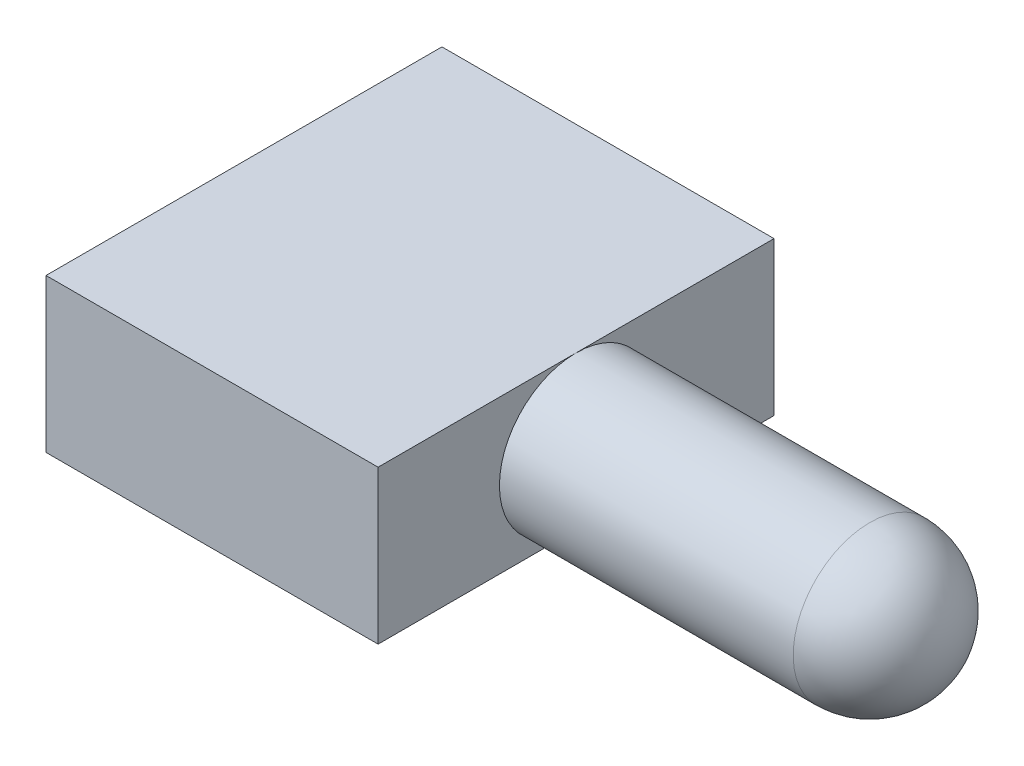
ISO-10303-21;
HEADER;
FILE_DESCRIPTION(('STEP AP214'),'2;1');
FILE_NAME('part.step','',(''),(''),'','','');
FILE_SCHEMA(('AUTOMOTIVE_DESIGN { 1 0 10303 214 1 1 1 1 }'));
ENDSEC;
DATA;
#1=APPLICATION_CONTEXT('core data for automotive mechanical design processes');
#2=APPLICATION_PROTOCOL_DEFINITION('international standard','automotive_design',2000,#1);
#3=PRODUCT_CONTEXT('',#1,'mechanical');
#4=PRODUCT('Part','Part','',(#3));
#5=PRODUCT_RELATED_PRODUCT_CATEGORY('part','',(#4));
#6=PRODUCT_DEFINITION_FORMATION('','',#4);
#7=PRODUCT_DEFINITION_CONTEXT('part definition',#1,'design');
#8=PRODUCT_DEFINITION('design','',#6,#7);
#9=PRODUCT_DEFINITION_SHAPE('','',#8);
#10=(LENGTH_UNIT() NAMED_UNIT(*) SI_UNIT(.MILLI.,.METRE.));
#11=(NAMED_UNIT(*) PLANE_ANGLE_UNIT() SI_UNIT($,.RADIAN.));
#12=(NAMED_UNIT(*) SI_UNIT($,.STERADIAN.) SOLID_ANGLE_UNIT());
#13=UNCERTAINTY_MEASURE_WITH_UNIT(LENGTH_MEASURE(1.E-05),#10,'distance_accuracy_value','');
#14=(GEOMETRIC_REPRESENTATION_CONTEXT(3) GLOBAL_UNCERTAINTY_ASSIGNED_CONTEXT((#13)) GLOBAL_UNIT_ASSIGNED_CONTEXT((#10,
#11,#12)) REPRESENTATION_CONTEXT('',''));
#15=CARTESIAN_POINT('',(0.,0.,0.));
#16=DIRECTION('',(0.,0.,1.));
#17=DIRECTION('',(1.,0.,0.));
#18=AXIS2_PLACEMENT_3D('',#15,#16,#17);
#19=CARTESIAN_POINT('',(-1.3,0.6,0.));
#20=DIRECTION('',(0.,1.,0.));
#21=DIRECTION('',(0.,0.,1.));
#22=AXIS2_PLACEMENT_3D('',#19,#20,#21);
#23=PLANE('',#22);
#24=DIRECTION('',(1.,0.,0.));
#25=VECTOR('',#24,1.);
#26=CARTESIAN_POINT('',(0.,0.6,-1.55));
#27=LINE('',#26,#25);
#28=CARTESIAN_POINT('',(1.3,0.6,-1.55));
#29=VERTEX_POINT('',#28);
#30=CARTESIAN_POINT('',(-1.3,0.6,-1.55));
#31=VERTEX_POINT('',#30);
#32=EDGE_CURVE('E71',#29,#31,#27,.F.);
#33=ORIENTED_EDGE('',*,*,#32,.T.);
#34=DIRECTION('',(0.,0.,1.));
#35=VECTOR('',#34,1.);
#36=CARTESIAN_POINT('',(-1.3,0.6,0.));
#37=LINE('',#36,#35);
#38=CARTESIAN_POINT('',(-1.3,0.6,1.55));
#39=VERTEX_POINT('',#38);
#40=EDGE_CURVE('E109',#39,#31,#37,.F.);
#41=ORIENTED_EDGE('',*,*,#40,.F.);
#42=DIRECTION('',(1.,0.,0.));
#43=VECTOR('',#42,1.);
#44=CARTESIAN_POINT('',(0.,0.6,1.55));
#45=LINE('',#44,#43);
#46=CARTESIAN_POINT('',(1.3,0.6,1.55));
#47=VERTEX_POINT('',#46);
#48=EDGE_CURVE('E110',#47,#39,#45,.F.);
#49=ORIENTED_EDGE('',*,*,#48,.F.);
#50=DIRECTION('',(0.,0.,1.));
#51=VECTOR('',#50,1.);
#52=CARTESIAN_POINT('',(1.3,0.6,0.));
#53=LINE('',#52,#51);
#54=CARTESIAN_POINT('',(1.3,0.6,0.));
#55=VERTEX_POINT('',#54);
#56=EDGE_CURVE('E127',#47,#55,#53,.F.);
#57=ORIENTED_EDGE('',*,*,#56,.T.);
#58=DIRECTION('',(0.,0.,1.));
#59=VECTOR('',#58,1.);
#60=CARTESIAN_POINT('',(1.3,0.6,0.));
#61=LINE('',#60,#59);
#62=EDGE_CURVE('E116',#55,#29,#61,.F.);
#63=ORIENTED_EDGE('',*,*,#62,.T.);
#64=EDGE_LOOP('',(#33,#41,#49,#57,#63));
#65=FACE_BOUND('',#64,.T.);
#66=ADVANCED_FACE('F17',(#65),#23,.T.);
#67=CARTESIAN_POINT('',(0.,0.,1.55));
#68=DIRECTION('',(0.,0.,1.));
#69=DIRECTION('',(1.,0.,0.));
#70=AXIS2_PLACEMENT_3D('',#67,#68,#69);
#71=PLANE('',#70);
#72=DIRECTION('',(0.,1.,0.));
#73=VECTOR('',#72,1.);
#74=CARTESIAN_POINT('',(1.3,0.,1.55));
#75=LINE('',#74,#73);
#76=CARTESIAN_POINT('',(1.3,-0.6,1.55));
#77=VERTEX_POINT('',#76);
#78=EDGE_CURVE('E113',#77,#47,#75,.T.);
#79=ORIENTED_EDGE('',*,*,#78,.T.);
#80=ORIENTED_EDGE('',*,*,#48,.T.);
#81=DIRECTION('',(0.,1.,0.));
#82=VECTOR('',#81,1.);
#83=CARTESIAN_POINT('',(-1.3,-0.6,1.55));
#84=LINE('',#83,#82);
#85=CARTESIAN_POINT('',(-1.3,-0.6,1.55));
#86=VERTEX_POINT('',#85);
#87=EDGE_CURVE('E106',#86,#39,#84,.T.);
#88=ORIENTED_EDGE('',*,*,#87,.F.);
#89=DIRECTION('',(1.,0.,0.));
#90=VECTOR('',#89,1.);
#91=CARTESIAN_POINT('',(1.3,-0.6,1.55));
#92=LINE('',#91,#90);
#93=EDGE_CURVE('E74',#77,#86,#92,.F.);
#94=ORIENTED_EDGE('',*,*,#93,.F.);
#95=EDGE_LOOP('',(#79,#80,#88,#94));
#96=FACE_BOUND('',#95,.T.);
#97=ADVANCED_FACE('F147',(#96),#71,.T.);
#98=CARTESIAN_POINT('',(-1.3,-0.6,0.));
#99=DIRECTION('',(-1.,0.,0.));
#100=DIRECTION('',(0.,0.,1.));
#101=AXIS2_PLACEMENT_3D('',#98,#99,#100);
#102=PLANE('',#101);
#103=DIRECTION('',(0.,1.,0.));
#104=VECTOR('',#103,1.);
#105=CARTESIAN_POINT('',(-1.3,0.,-1.55));
#106=LINE('',#105,#104);
#107=CARTESIAN_POINT('',(-1.3,-0.6,-1.55));
#108=VERTEX_POINT('',#107);
#109=EDGE_CURVE('E75',#31,#108,#106,.F.);
#110=ORIENTED_EDGE('',*,*,#109,.T.);
#111=DIRECTION('',(0.,0.,-1.));
#112=VECTOR('',#111,1.);
#113=CARTESIAN_POINT('',(-1.3,-0.6,0.));
#114=LINE('',#113,#112);
#115=EDGE_CURVE('E80',#86,#108,#114,.T.);
#116=ORIENTED_EDGE('',*,*,#115,.F.);
#117=ORIENTED_EDGE('',*,*,#87,.T.);
#118=ORIENTED_EDGE('',*,*,#40,.T.);
#119=EDGE_LOOP('',(#110,#116,#117,#118));
#120=FACE_BOUND('',#119,.T.);
#121=ADVANCED_FACE('F149',(#120),#102,.T.);
#122=CARTESIAN_POINT('',(0.,0.,-1.55));
#123=DIRECTION('',(0.,0.,1.));
#124=DIRECTION('',(1.,0.,0.));
#125=AXIS2_PLACEMENT_3D('',#122,#123,#124);
#126=PLANE('',#125);
#127=DIRECTION('',(1.,0.,0.));
#128=VECTOR('',#127,1.);
#129=CARTESIAN_POINT('',(1.3,-0.6,-1.55));
#130=LINE('',#129,#128);
#131=CARTESIAN_POINT('',(1.3,-0.6,-1.55));
#132=VERTEX_POINT('',#131);
#133=EDGE_CURVE('E69',#108,#132,#130,.T.);
#134=ORIENTED_EDGE('',*,*,#133,.F.);
#135=ORIENTED_EDGE('',*,*,#109,.F.);
#136=ORIENTED_EDGE('',*,*,#32,.F.);
#137=DIRECTION('',(0.,1.,0.));
#138=VECTOR('',#137,1.);
#139=CARTESIAN_POINT('',(1.3,0.,-1.55));
#140=LINE('',#139,#138);
#141=EDGE_CURVE('E66',#132,#29,#140,.T.);
#142=ORIENTED_EDGE('',*,*,#141,.F.);
#143=EDGE_LOOP('',(#134,#135,#136,#142));
#144=FACE_BOUND('',#143,.T.);
#145=ADVANCED_FACE('F67',(#144),#126,.F.);
#146=CARTESIAN_POINT('',(1.3,-0.6,0.));
#147=DIRECTION('',(0.,-1.,0.));
#148=DIRECTION('',(0.,0.,-1.));
#149=AXIS2_PLACEMENT_3D('',#146,#147,#148);
#150=PLANE('',#149);
#151=DIRECTION('',(0.,0.,-1.));
#152=VECTOR('',#151,1.);
#153=CARTESIAN_POINT('',(1.3,-0.6,0.));
#154=LINE('',#153,#152);
#155=CARTESIAN_POINT('',(1.3,-0.6,0.));
#156=VERTEX_POINT('',#155);
#157=EDGE_CURVE('E34',#156,#132,#154,.T.);
#158=ORIENTED_EDGE('',*,*,#157,.F.);
#159=DIRECTION('',(0.,0.,-1.));
#160=VECTOR('',#159,1.);
#161=CARTESIAN_POINT('',(1.3,-0.6,0.));
#162=LINE('',#161,#160);
#163=EDGE_CURVE('E85',#77,#156,#162,.T.);
#164=ORIENTED_EDGE('',*,*,#163,.F.);
#165=ORIENTED_EDGE('',*,*,#93,.T.);
#166=ORIENTED_EDGE('',*,*,#115,.T.);
#167=ORIENTED_EDGE('',*,*,#133,.T.);
#168=EDGE_LOOP('',(#158,#164,#165,#166,#167));
#169=FACE_BOUND('',#168,.T.);
#170=ADVANCED_FACE('F77',(#169),#150,.T.);
#171=CARTESIAN_POINT('',(1.3,0.6,0.));
#172=DIRECTION('',(1.,0.,0.));
#173=DIRECTION('',(0.,0.,-1.));
#174=AXIS2_PLACEMENT_3D('',#171,#172,#173);
#175=PLANE('',#174);
#176=ORIENTED_EDGE('',*,*,#141,.T.);
#177=ORIENTED_EDGE('',*,*,#62,.F.);
#178=CARTESIAN_POINT('',(1.3,0.,0.));
#179=DIRECTION('',(1.,0.,0.));
#180=DIRECTION('',(0.,0.,-1.));
#181=AXIS2_PLACEMENT_3D('',#178,#179,#180);
#182=CIRCLE('',#181,0.6);
#183=EDGE_CURVE('E20',#156,#55,#182,.T.);
#184=ORIENTED_EDGE('',*,*,#183,.F.);
#185=ORIENTED_EDGE('',*,*,#157,.T.);
#186=EDGE_LOOP('',(#176,#177,#184,#185));
#187=FACE_BOUND('',#186,.T.);
#188=ADVANCED_FACE('F82',(#187),#175,.T.);
#189=CARTESIAN_POINT('',(1.3,0.6,0.));
#190=DIRECTION('',(1.,0.,0.));
#191=DIRECTION('',(0.,0.,-1.));
#192=AXIS2_PLACEMENT_3D('',#189,#190,#191);
#193=PLANE('',#192);
#194=ORIENTED_EDGE('',*,*,#78,.F.);
#195=ORIENTED_EDGE('',*,*,#163,.T.);
#196=CARTESIAN_POINT('',(1.3,0.,0.));
#197=DIRECTION('',(1.,0.,0.));
#198=DIRECTION('',(0.,0.,-1.));
#199=AXIS2_PLACEMENT_3D('',#196,#197,#198);
#200=CIRCLE('',#199,0.6);
#201=EDGE_CURVE('E26',#55,#156,#200,.T.);
#202=ORIENTED_EDGE('',*,*,#201,.F.);
#203=ORIENTED_EDGE('',*,*,#56,.F.);
#204=EDGE_LOOP('',(#194,#195,#202,#203));
#205=FACE_BOUND('',#204,.T.);
#206=ADVANCED_FACE('F141',(#205),#193,.T.);
#207=CARTESIAN_POINT('',(3.6,0.,0.));
#208=DIRECTION('',(1.,0.,0.));
#209=DIRECTION('',(0.,1.,0.));
#210=AXIS2_PLACEMENT_3D('',#207,#208,#209);
#211=SPHERICAL_SURFACE('',#210,0.6);
#212=CARTESIAN_POINT('',(4.2,0.,0.));
#213=VERTEX_POINT('',#212);
#214=VERTEX_LOOP('',#213);
#215=FACE_BOUND('',#214,.T.);
#216=CARTESIAN_POINT('',(3.6,0.,0.));
#217=DIRECTION('',(1.,0.,0.));
#218=DIRECTION('',(0.,0.,-1.));
#219=AXIS2_PLACEMENT_3D('',#216,#217,#218);
#220=CIRCLE('',#219,0.6);
#221=CARTESIAN_POINT('',(3.6,0.,-0.6));
#222=VERTEX_POINT('',#221);
#223=EDGE_CURVE('E11',#222,#222,#220,.F.);
#224=ORIENTED_EDGE('',*,*,#223,.F.);
#225=EDGE_LOOP('',(#224));
#226=FACE_BOUND('',#225,.T.);
#227=ADVANCED_FACE('F159',(#215,#226),#211,.T.);
#228=CARTESIAN_POINT('',(1.3,0.,0.));
#229=DIRECTION('',(1.,0.,0.));
#230=DIRECTION('',(0.,0.,-1.));
#231=AXIS2_PLACEMENT_3D('',#228,#229,#230);
#232=CYLINDRICAL_SURFACE('',#231,0.6);
#233=ORIENTED_EDGE('',*,*,#223,.T.);
#234=EDGE_LOOP('',(#233));
#235=FACE_BOUND('',#234,.T.);
#236=ORIENTED_EDGE('',*,*,#183,.T.);
#237=ORIENTED_EDGE('',*,*,#201,.T.);
#238=EDGE_LOOP('',(#236,#237));
#239=FACE_BOUND('',#238,.T.);
#240=ADVANCED_FACE('F139',(#235,#239),#232,.T.);
#241=CLOSED_SHELL('',(#66,#97,#121,#145,#170,#188,#206,#227,#240));
#242=MANIFOLD_SOLID_BREP('B1',#241);
#243=ADVANCED_BREP_SHAPE_REPRESENTATION('',(#18,#242),#14);
#244=SHAPE_DEFINITION_REPRESENTATION(#9,#243);
ENDSEC;
END-ISO-10303-21;
